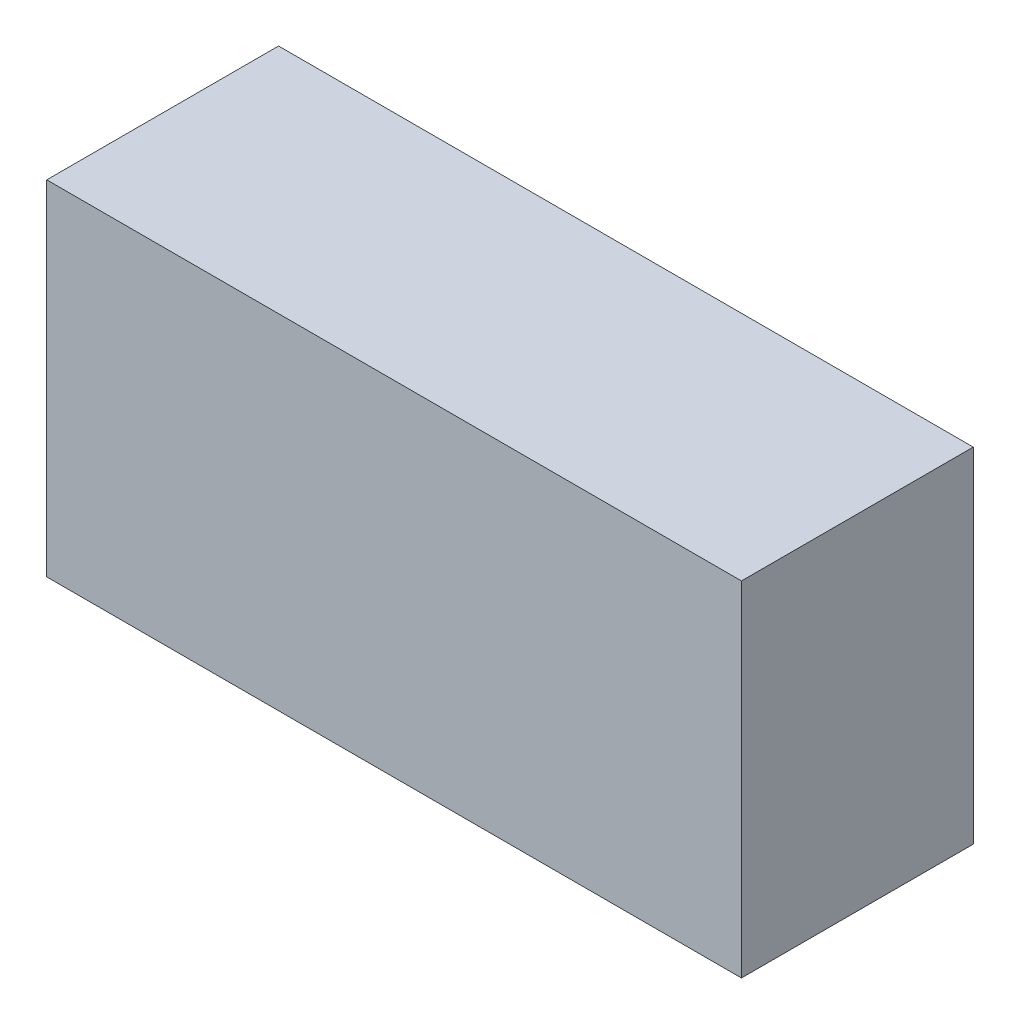
ISO-10303-21;
HEADER;
FILE_DESCRIPTION(('STEP AP214'),'2;1');
FILE_NAME('part.step','',(''),(''),'','','');
FILE_SCHEMA(('AUTOMOTIVE_DESIGN { 1 0 10303 214 1 1 1 1 }'));
ENDSEC;
DATA;
#1=APPLICATION_CONTEXT('core data for automotive mechanical design processes');
#2=APPLICATION_PROTOCOL_DEFINITION('international standard','automotive_design',2000,#1);
#3=PRODUCT_CONTEXT('',#1,'mechanical');
#4=PRODUCT('Part','Part','',(#3));
#5=PRODUCT_RELATED_PRODUCT_CATEGORY('part','',(#4));
#6=PRODUCT_DEFINITION_FORMATION('','',#4);
#7=PRODUCT_DEFINITION_CONTEXT('part definition',#1,'design');
#8=PRODUCT_DEFINITION('design','',#6,#7);
#9=PRODUCT_DEFINITION_SHAPE('','',#8);
#10=(LENGTH_UNIT() NAMED_UNIT(*) SI_UNIT(.MILLI.,.METRE.));
#11=(NAMED_UNIT(*) PLANE_ANGLE_UNIT() SI_UNIT($,.RADIAN.));
#12=(NAMED_UNIT(*) SI_UNIT($,.STERADIAN.) SOLID_ANGLE_UNIT());
#13=UNCERTAINTY_MEASURE_WITH_UNIT(LENGTH_MEASURE(1.E-05),#10,'distance_accuracy_value','');
#14=(GEOMETRIC_REPRESENTATION_CONTEXT(3) GLOBAL_UNCERTAINTY_ASSIGNED_CONTEXT((#13)) GLOBAL_UNIT_ASSIGNED_CONTEXT((#10,
#11,#12)) REPRESENTATION_CONTEXT('',''));
#15=CARTESIAN_POINT('',(0.,0.,0.));
#16=DIRECTION('',(0.,0.,1.));
#17=DIRECTION('',(1.,0.,0.));
#18=AXIS2_PLACEMENT_3D('',#15,#16,#17);
#19=CARTESIAN_POINT('',(0.,0.,1.));
#20=DIRECTION('',(0.,0.,1.));
#21=DIRECTION('',(1.,0.,0.));
#22=AXIS2_PLACEMENT_3D('',#19,#20,#21);
#23=PLANE('',#22);
#24=DIRECTION('',(1.,0.,0.));
#25=VECTOR('',#24,1.);
#26=CARTESIAN_POINT('',(1.4984,0.7544,1.));
#27=LINE('',#26,#25);
#28=CARTESIAN_POINT('',(-1.4984,0.7544,1.));
#29=VERTEX_POINT('',#28);
#30=CARTESIAN_POINT('',(1.4984,0.7544,1.));
#31=VERTEX_POINT('',#30);
#32=EDGE_CURVE('E68',#29,#31,#27,.T.);
#33=ORIENTED_EDGE('',*,*,#32,.F.);
#34=DIRECTION('',(0.,1.,0.));
#35=VECTOR('',#34,1.);
#36=CARTESIAN_POINT('',(-1.4984,0.7544,1.));
#37=LINE('',#36,#35);
#38=CARTESIAN_POINT('',(-1.4984,-0.729,1.));
#39=VERTEX_POINT('',#38);
#40=EDGE_CURVE('E20',#39,#29,#37,.T.);
#41=ORIENTED_EDGE('',*,*,#40,.F.);
#42=DIRECTION('',(1.,0.,0.));
#43=VECTOR('',#42,1.);
#44=CARTESIAN_POINT('',(-1.4984,-0.729,1.));
#45=LINE('',#44,#43);
#46=CARTESIAN_POINT('',(1.4984,-0.729,1.));
#47=VERTEX_POINT('',#46);
#48=EDGE_CURVE('E58',#47,#39,#45,.F.);
#49=ORIENTED_EDGE('',*,*,#48,.F.);
#50=DIRECTION('',(0.,1.,0.));
#51=VECTOR('',#50,1.);
#52=CARTESIAN_POINT('',(1.4984,-0.729,1.));
#53=LINE('',#52,#51);
#54=EDGE_CURVE('E53',#31,#47,#53,.F.);
#55=ORIENTED_EDGE('',*,*,#54,.F.);
#56=EDGE_LOOP('',(#33,#41,#49,#55));
#57=FACE_BOUND('',#56,.T.);
#58=ADVANCED_FACE('F17',(#57),#23,.T.);
#59=CARTESIAN_POINT('',(-1.4984,0.7544,0.));
#60=DIRECTION('',(-1.,0.,0.));
#61=DIRECTION('',(0.,0.,1.));
#62=AXIS2_PLACEMENT_3D('',#59,#60,#61);
#63=PLANE('',#62);
#64=DIRECTION('',(0.,0.,1.));
#65=VECTOR('',#64,1.);
#66=CARTESIAN_POINT('',(-1.4984,0.7544,0.));
#67=LINE('',#66,#65);
#68=CARTESIAN_POINT('',(-1.4984,0.7544,0.));
#69=VERTEX_POINT('',#68);
#70=EDGE_CURVE('E79',#69,#29,#67,.T.);
#71=ORIENTED_EDGE('',*,*,#70,.F.);
#72=DIRECTION('',(0.,1.,0.));
#73=VECTOR('',#72,1.);
#74=CARTESIAN_POINT('',(-1.4984,0.,0.));
#75=LINE('',#74,#73);
#76=CARTESIAN_POINT('',(-1.4984,-0.729,0.));
#77=VERTEX_POINT('',#76);
#78=EDGE_CURVE('E74',#69,#77,#75,.F.);
#79=ORIENTED_EDGE('',*,*,#78,.T.);
#80=DIRECTION('',(0.,0.,-1.));
#81=VECTOR('',#80,1.);
#82=CARTESIAN_POINT('',(-1.4984,-0.729,0.));
#83=LINE('',#82,#81);
#84=EDGE_CURVE('E63',#39,#77,#83,.T.);
#85=ORIENTED_EDGE('',*,*,#84,.F.);
#86=ORIENTED_EDGE('',*,*,#40,.T.);
#87=EDGE_LOOP('',(#71,#79,#85,#86));
#88=FACE_BOUND('',#87,.T.);
#89=ADVANCED_FACE('F73',(#88),#63,.T.);
#90=CARTESIAN_POINT('',(-1.4984,-0.729,0.));
#91=DIRECTION('',(0.,-1.,0.));
#92=DIRECTION('',(0.,0.,-1.));
#93=AXIS2_PLACEMENT_3D('',#90,#91,#92);
#94=PLANE('',#93);
#95=ORIENTED_EDGE('',*,*,#84,.T.);
#96=DIRECTION('',(1.,0.,0.));
#97=VECTOR('',#96,1.);
#98=CARTESIAN_POINT('',(0.,-0.729,0.));
#99=LINE('',#98,#97);
#100=CARTESIAN_POINT('',(1.4984,-0.729,0.));
#101=VERTEX_POINT('',#100);
#102=EDGE_CURVE('E84',#77,#101,#99,.T.);
#103=ORIENTED_EDGE('',*,*,#102,.T.);
#104=DIRECTION('',(0.,0.,-1.));
#105=VECTOR('',#104,1.);
#106=CARTESIAN_POINT('',(1.4984,-0.729,0.));
#107=LINE('',#106,#105);
#108=EDGE_CURVE('E65',#47,#101,#107,.T.);
#109=ORIENTED_EDGE('',*,*,#108,.F.);
#110=ORIENTED_EDGE('',*,*,#48,.T.);
#111=EDGE_LOOP('',(#95,#103,#109,#110));
#112=FACE_BOUND('',#111,.T.);
#113=ADVANCED_FACE('F60',(#112),#94,.T.);
#114=CARTESIAN_POINT('',(1.4984,-0.729,0.));
#115=DIRECTION('',(1.,0.,0.));
#116=DIRECTION('',(0.,0.,-1.));
#117=AXIS2_PLACEMENT_3D('',#114,#115,#116);
#118=PLANE('',#117);
#119=ORIENTED_EDGE('',*,*,#108,.T.);
#120=DIRECTION('',(0.,1.,0.));
#121=VECTOR('',#120,1.);
#122=CARTESIAN_POINT('',(1.4984,0.,0.));
#123=LINE('',#122,#121);
#124=CARTESIAN_POINT('',(1.4984,0.7544,0.));
#125=VERTEX_POINT('',#124);
#126=EDGE_CURVE('E26',#101,#125,#123,.T.);
#127=ORIENTED_EDGE('',*,*,#126,.T.);
#128=DIRECTION('',(0.,0.,1.));
#129=VECTOR('',#128,1.);
#130=CARTESIAN_POINT('',(1.4984,0.7544,0.));
#131=LINE('',#130,#129);
#132=EDGE_CURVE('E34',#31,#125,#131,.F.);
#133=ORIENTED_EDGE('',*,*,#132,.F.);
#134=ORIENTED_EDGE('',*,*,#54,.T.);
#135=EDGE_LOOP('',(#119,#127,#133,#134));
#136=FACE_BOUND('',#135,.T.);
#137=ADVANCED_FACE('F88',(#136),#118,.T.);
#138=CARTESIAN_POINT('',(1.4984,0.7544,0.));
#139=DIRECTION('',(0.,1.,0.));
#140=DIRECTION('',(0.,0.,1.));
#141=AXIS2_PLACEMENT_3D('',#138,#139,#140);
#142=PLANE('',#141);
#143=ORIENTED_EDGE('',*,*,#132,.T.);
#144=DIRECTION('',(1.,0.,0.));
#145=VECTOR('',#144,1.);
#146=CARTESIAN_POINT('',(0.,0.7544,0.));
#147=LINE('',#146,#145);
#148=EDGE_CURVE('E11',#125,#69,#147,.F.);
#149=ORIENTED_EDGE('',*,*,#148,.T.);
#150=ORIENTED_EDGE('',*,*,#70,.T.);
#151=ORIENTED_EDGE('',*,*,#32,.T.);
#152=EDGE_LOOP('',(#143,#149,#150,#151));
#153=FACE_BOUND('',#152,.T.);
#154=ADVANCED_FACE('F91',(#153),#142,.T.);
#155=CARTESIAN_POINT('',(0.,0.,0.));
#156=DIRECTION('',(0.,0.,1.));
#157=DIRECTION('',(1.,0.,0.));
#158=AXIS2_PLACEMENT_3D('',#155,#156,#157);
#159=PLANE('',#158);
#160=ORIENTED_EDGE('',*,*,#126,.F.);
#161=ORIENTED_EDGE('',*,*,#102,.F.);
#162=ORIENTED_EDGE('',*,*,#78,.F.);
#163=ORIENTED_EDGE('',*,*,#148,.F.);
#164=EDGE_LOOP('',(#160,#161,#162,#163));
#165=FACE_BOUND('',#164,.T.);
#166=ADVANCED_FACE('F90',(#165),#159,.F.);
#167=CLOSED_SHELL('',(#58,#89,#113,#137,#154,#166));
#168=MANIFOLD_SOLID_BREP('B1',#167);
#169=ADVANCED_BREP_SHAPE_REPRESENTATION('',(#18,#168),#14);
#170=SHAPE_DEFINITION_REPRESENTATION(#9,#169);
ENDSEC;
END-ISO-10303-21;
